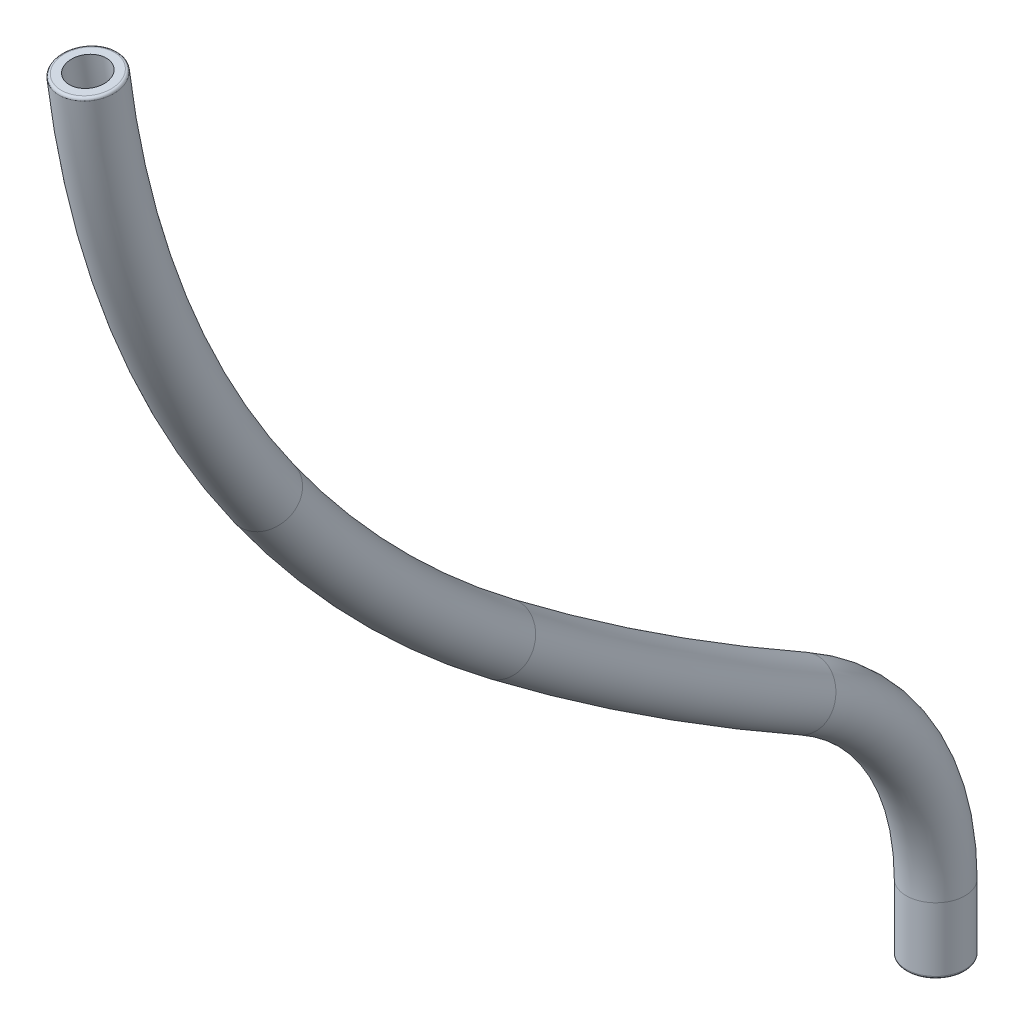
ISO-10303-21;
HEADER;
FILE_DESCRIPTION(('STEP AP214'),'2;1');
FILE_NAME('part.step','',(''),(''),'','','');
FILE_SCHEMA(('AUTOMOTIVE_DESIGN { 1 0 10303 214 1 1 1 1 }'));
ENDSEC;
DATA;
#1=APPLICATION_CONTEXT('core data for automotive mechanical design processes');
#2=APPLICATION_PROTOCOL_DEFINITION('international standard','automotive_design',2000,#1);
#3=PRODUCT_CONTEXT('',#1,'mechanical');
#4=PRODUCT('Part','Part','',(#3));
#5=PRODUCT_RELATED_PRODUCT_CATEGORY('part','',(#4));
#6=PRODUCT_DEFINITION_FORMATION('','',#4);
#7=PRODUCT_DEFINITION_CONTEXT('part definition',#1,'design');
#8=PRODUCT_DEFINITION('design','',#6,#7);
#9=PRODUCT_DEFINITION_SHAPE('','',#8);
#10=(LENGTH_UNIT() NAMED_UNIT(*) SI_UNIT(.MILLI.,.METRE.));
#11=(NAMED_UNIT(*) PLANE_ANGLE_UNIT() SI_UNIT($,.RADIAN.));
#12=(NAMED_UNIT(*) SI_UNIT($,.STERADIAN.) SOLID_ANGLE_UNIT());
#13=UNCERTAINTY_MEASURE_WITH_UNIT(LENGTH_MEASURE(1.E-05),#10,'distance_accuracy_value','');
#14=(GEOMETRIC_REPRESENTATION_CONTEXT(3) GLOBAL_UNCERTAINTY_ASSIGNED_CONTEXT((#13)) GLOBAL_UNIT_ASSIGNED_CONTEXT((#10,
#11,#12)) REPRESENTATION_CONTEXT('',''));
#15=CARTESIAN_POINT('',(0.,0.,0.));
#16=DIRECTION('',(0.,0.,1.));
#17=DIRECTION('',(1.,0.,0.));
#18=AXIS2_PLACEMENT_3D('',#15,#16,#17);
#19=CARTESIAN_POINT('',(0.,492.022492382083,-51.4306631675288));
#20=DIRECTION('',(-1.,0.,0.));
#21=DIRECTION('',(0.,0.,1.));
#22=AXIS2_PLACEMENT_3D('',#19,#20,#21);
#23=TOROIDAL_SURFACE('',#22,372.403386785215,11.);
#24=CARTESIAN_POINT('',(-10.9389506293703,445.589237813654,316.900172824865));
#25=CARTESIAN_POINT('',(-10.9386689656889,446.581433599445,317.022569606189));
#26=CARTESIAN_POINT('',(-9.9445005721548,446.568559426432,317.126958253662));
#27=CARTESIAN_POINT('',(-11.0040237684498,445.513801242333,317.510607330084));
#28=CARTESIAN_POINT('',(-11.0038954770165,446.506145093581,317.633037190342));
#29=CARTESIAN_POINT('',(-10.003657971318,446.500116921425,317.681915882388));
#30=CARTESIAN_POINT('',(-11.0170964853762,445.437690624373,318.126501851227));
#31=CARTESIAN_POINT('',(-11.0171134043711,446.430185788153,318.248943870202));
#32=CARTESIAN_POINT('',(-10.0155422594329,446.431062243931,318.241837236388));
#33=CARTESIAN_POINT('',(-10.9388699721977,445.286281841146,319.351727543584));
#34=CARTESIAN_POINT('',(-10.9391856247705,446.279070437093,319.474244096726));
#35=CARTESIAN_POINT('',(-9.9444272474525,446.293688797245,319.355712922497));
#36=CARTESIAN_POINT('',(-10.8475707366594,445.210983675921,319.961058714456));
#37=CARTESIAN_POINT('',(-10.8480243493391,446.203914734609,320.083634861014));
#38=CARTESIAN_POINT('',(-9.86142794241762,446.22537002809,319.909667254296));
#39=CARTESIAN_POINT('',(-10.5631918610782,445.063337126568,321.155860963183));
#40=CARTESIAN_POINT('',(-10.5639125423896,446.05653988466,321.278605694619));
#41=CARTESIAN_POINT('',(-9.60290169188922,446.091407723095,320.995884117802));
#42=CARTESIAN_POINT('',(-10.3701121506918,444.990988744478,321.741332024547));
#43=CARTESIAN_POINT('',(-10.3709481570911,445.984321685565,321.86417807419));
#44=CARTESIAN_POINT('',(-9.42737468244704,446.025764189103,321.528146634517));
#45=CARTESIAN_POINT('',(-9.88765317778455,444.851295379317,322.871793626736));
#46=CARTESIAN_POINT('',(-9.88869501476413,445.844872412321,322.994885344465));
#47=CARTESIAN_POINT('',(-8.98877561616776,445.899015848433,322.555869956104));
#48=CARTESIAN_POINT('',(-9.59827392840626,444.783950395564,323.416784173086));
#49=CARTESIAN_POINT('',(-9.59939576051537,445.777642775199,323.540008583219));
#50=CARTESIAN_POINT('',(-8.72570357127839,445.837911041136,323.051330765997));
#51=CARTESIAN_POINT('',(-8.9314309887007,444.656175388272,324.450813052336));
#52=CARTESIAN_POINT('',(-8.93267497135608,445.65008011365,324.574334725436));
#53=CARTESIAN_POINT('',(-8.11948271700063,445.721974849246,323.991385109837));
#54=CARTESIAN_POINT('',(-8.55396745450346,444.595745352477,324.939851484409));
#55=CARTESIAN_POINT('',(-8.55524745582463,445.589748842967,325.063523408889));
#56=CARTESIAN_POINT('',(-7.77633404954861,445.667143453534,324.435978733944));
#57=CARTESIAN_POINT('',(-7.72167048108805,444.483515207737,325.848094857624));
#58=CARTESIAN_POINT('',(-7.72297599493028,445.477696691234,325.972084491114));
#59=CARTESIAN_POINT('',(-7.01970043735279,445.565310460549,325.261679025129));
#60=CARTESIAN_POINT('',(-7.26683701175873,444.431715102151,326.267299771587));
#61=CARTESIAN_POINT('',(-7.26813085934242,445.425977712453,326.391441465585));
#62=CARTESIAN_POINT('',(-6.60621546523522,445.518308866322,325.6427856675));
#63=CARTESIAN_POINT('',(-6.29271301969407,444.33821513163,327.023974533141));
#64=CARTESIAN_POINT('',(-6.29393354665393,445.332620000304,327.148420985141));
#65=CARTESIAN_POINT('',(-5.72064819972188,445.433469885878,326.330692099418));
#66=CARTESIAN_POINT('',(-5.77342267810065,444.296515238311,327.361444610422));
#67=CARTESIAN_POINT('',(-5.774585424441,445.29098306426,327.486028956861));
#68=CARTESIAN_POINT('',(-5.24856607100059,445.395632473908,326.637492097781));
#69=CARTESIAN_POINT('',(-4.68512564281849,444.224399006572,327.945070891793));
#70=CARTESIAN_POINT('',(-4.68612490799675,445.218972840254,328.069914996016));
#71=CARTESIAN_POINT('',(-4.259205129835,445.330195837122,327.168077013965));
#72=CARTESIAN_POINT('',(-4.11611900253577,444.193982656029,328.191227193973));
#73=CARTESIAN_POINT('',(-4.11702099463693,445.188601097223,328.316180536576));
#74=CARTESIAN_POINT('',(-3.74192636594161,445.302596601309,327.39186202096));
#75=CARTESIAN_POINT('',(-2.94454353238739,444.145296752098,328.585237862403));
#76=CARTESIAN_POINT('',(-2.94521037518814,445.13998494026,328.710378662189));
#77=CARTESIAN_POINT('',(-2.67685775671581,445.258419820499,327.750064011381));
#78=CARTESIAN_POINT('',(-2.34197482499202,444.127027154388,328.733092587337));
#79=CARTESIAN_POINT('',(-2.34251581659257,445.121741605657,328.858302495641));
#80=CARTESIAN_POINT('',(-2.12906802272002,445.241842235287,327.884481320893));
#81=CARTESIAN_POINT('',(-1.12037738498151,444.103153040165,328.926304438881));
#82=CARTESIAN_POINT('',(-1.12063780228041,445.09790115951,329.051609819212));
#83=CARTESIAN_POINT('',(-1.01852489543774,445.220179174446,328.060133583683));
#84=CARTESIAN_POINT('',(-0.501348622937057,444.097548546299,328.971661382221));
#85=CARTESIAN_POINT('',(-0.501468613220143,445.092304642712,329.096988486919));
#86=CARTESIAN_POINT('',(-0.455771475397328,445.215093719365,328.101368370345));
#87=CARTESIAN_POINT('',(0.735592897777408,444.099163752542,328.958589593615));
#88=CARTESIAN_POINT('',(0.735767772413724,445.09391758219,329.083910165657));
#89=CARTESIAN_POINT('',(0.668720816161282,445.216559338292,328.089484579651));
#90=CARTESIAN_POINT('',(1.35350566086319,444.106383401798,328.900161273229));
#91=CARTESIAN_POINT('',(1.3538199642516,445.101126948542,329.025453905844));
#92=CARTESIAN_POINT('',(1.23045969169381,445.223110366155,328.036366376451));
#93=CARTESIAN_POINT('',(2.5706781842207,444.133441947045,328.6811780801));
#94=CARTESIAN_POINT('',(2.57126897380866,445.128147281524,328.806362861213));
#95=CARTESIAN_POINT('',(2.33698016747338,445.247662929697,327.837284936618));
#96=CARTESIAN_POINT('',(3.16993790704457,444.153280868368,328.520623002339));
#97=CARTESIAN_POINT('',(3.17065166215386,445.147957627123,328.645733111952));
#98=CARTESIAN_POINT('',(2.8817617336769,445.265664488363,327.691321513602));
#99=CARTESIAN_POINT('',(4.3328026568719,444.205015396129,328.101940388645));
#100=CARTESIAN_POINT('',(4.33374382676597,445.199617838465,328.226852646029));
#101=CARTESIAN_POINT('',(3.93891150624718,445.312607507265,327.310689822045));
#102=CARTESIAN_POINT('',(4.89640701998706,444.236911226984,327.843811036542));
#103=CARTESIAN_POINT('',(4.89744100132872,445.231466742371,327.968609728309));
#104=CARTESIAN_POINT('',(4.45127910907913,445.341549171131,327.076019902392));
#105=CARTESIAN_POINT('',(5.97192827651459,444.31185302708,327.237318466332));
#106=CARTESIAN_POINT('',(5.97311518984241,445.306297950957,327.361850082859));
#107=CARTESIAN_POINT('',(5.42902570592233,445.409549595263,326.524646832035));
#108=CARTESIAN_POINT('',(6.48384719794336,444.354898558597,326.888958790568));
#109=CARTESIAN_POINT('',(6.48508633557585,445.349278217684,327.013349879622));
#110=CARTESIAN_POINT('',(5.89440654358486,445.448607958358,326.207946901737));
#111=CARTESIAN_POINT('',(7.44144174495586,444.450913091835,326.111935270094));
#112=CARTESIAN_POINT('',(7.44274198482708,445.445145950932,326.236018162883));
#113=CARTESIAN_POINT('',(6.76494704086896,445.53572845977,325.501541037832));
#114=CARTESIAN_POINT('',(7.88712416099397,444.503881075064,325.683279667385));
#115=CARTESIAN_POINT('',(7.88843002634539,445.498030554811,325.807209860761));
#116=CARTESIAN_POINT('',(7.17011287363088,445.583789673986,325.11184259718));
#117=CARTESIAN_POINT('',(8.69976386631999,444.618257397537,324.757669453443));
#118=CARTESIAN_POINT('',(8.7010316760564,445.612224453905,324.881282683639));
#119=CARTESIAN_POINT('',(7.90887624210908,445.687569854029,324.270353779382));
#120=CARTESIAN_POINT('',(9.06670155973732,444.679667831489,324.26069789193));
#121=CARTESIAN_POINT('',(9.06792748812077,445.673533947064,324.384162203626));
#122=CARTESIAN_POINT('',(8.24245596339756,445.743290720336,323.818547992412));
#123=CARTESIAN_POINT('',(9.71143942147574,444.809197053038,323.212474852978));
#124=CARTESIAN_POINT('',(9.71253163721777,445.802846563803,323.335646765119));
#125=CARTESIAN_POINT('',(8.82858129225068,445.860818376799,322.865589453944));
#126=CARTESIAN_POINT('',(9.98919664946346,444.87731905168,322.66119739373));
#127=CARTESIAN_POINT('',(9.99020377840603,445.870851159727,322.78423986829));
#128=CARTESIAN_POINT('',(9.08108786314861,445.922628080063,322.364413081861));
#129=CARTESIAN_POINT('',(10.4471934945817,445.018262713186,321.520620194565));
#130=CARTESIAN_POINT('',(10.4479856509893,446.011546962636,321.643425265637));
#131=CARTESIAN_POINT('',(9.49744863143789,446.050510594394,321.327493452719));
#132=CARTESIAN_POINT('',(10.6275500149925,445.09107862419,320.931366989839));
#133=CARTESIAN_POINT('',(10.6282232688502,446.084231031901,321.054075435118));
#134=CARTESIAN_POINT('',(9.66140910453863,446.116578187876,320.791792501817));
#135=CARTESIAN_POINT('',(10.8375480379322,445.211485619777,319.956997894717));
#136=CARTESIAN_POINT('',(10.8380055480718,446.204418254375,320.07955213296));
#137=CARTESIAN_POINT('',(9.85231639812018,446.225825332714,319.905975472783));
#138=CARTESIAN_POINT('',(10.8983465389391,445.258293414613,319.578217404241));
#139=CARTESIAN_POINT('',(10.8987165307857,446.251137875116,319.700731837894));
#140=CARTESIAN_POINT('',(9.90758776267188,446.268294547715,319.561619069578));
#141=CARTESIAN_POINT('',(10.9795553687277,445.352433564906,318.816415833447));
#142=CARTESIAN_POINT('',(10.9797420700025,446.345097906917,318.938868483562));
#143=CARTESIAN_POINT('',(9.98141397157074,446.353708443977,318.869051003497));
#144=CARTESIAN_POINT('',(10.9999656974342,445.399765920364,318.43339475312));
#145=CARTESIAN_POINT('',(11.0000603279156,446.392338196757,318.555826407191));
#146=CARTESIAN_POINT('',(9.99996881584956,446.39665312524,318.520839340614));
#147=CARTESIAN_POINT('',(11.0000546401598,445.522899508129,317.43698353165));
#148=CARTESIAN_POINT('',(10.999904147137,446.515225104725,317.559413037445));
#149=CARTESIAN_POINT('',(10.0000496728729,446.508371691931,317.614983091645));
#150=CARTESIAN_POINT('',(10.9479298129737,445.598735165034,316.823318241271));
#151=CARTESIAN_POINT('',(10.9476356297607,446.590907228199,316.945753853345));
#152=CARTESIAN_POINT('',(9.9526634663398,446.577176433292,317.057088314017));
#153=CARTESIAN_POINT('',(10.7405522120217,445.74832096413,315.612874669198));
#154=CARTESIAN_POINT('',(10.7399705522066,446.740182528293,315.735373453623));
#155=CARTESIAN_POINT('',(9.76413837456506,446.712892547405,315.956650905118));
#156=CARTESIAN_POINT('',(10.5851753076317,445.822068484544,315.016117616199));
#157=CARTESIAN_POINT('',(10.5844650264162,446.81377364838,315.138668913155));
#158=CARTESIAN_POINT('',(9.62288664330149,446.779801539998,315.414127573071));
#159=CARTESIAN_POINT('',(10.1757165750825,445.9652890508,313.857202104193));
#160=CARTESIAN_POINT('',(10.1747661830847,446.95668283884,313.979907329939));
#161=CARTESIAN_POINT('',(9.25065143189322,446.909740313905,314.360535016226));
#162=CARTESIAN_POINT('',(9.92168188557633,446.034764119683,313.29502727019));
#163=CARTESIAN_POINT('',(9.92063280997782,447.026004065549,313.417824694428));
#164=CARTESIAN_POINT('',(9.0197108050694,446.972771931191,313.84945090467));
#165=CARTESIAN_POINT('',(9.32218334240934,446.167478831985,312.221141648017));
#166=CARTESIAN_POINT('',(9.32096940073938,447.15841775533,312.3441645868));
#167=CARTESIAN_POINT('',(8.47471212946301,447.093177100201,312.873160409843));
#168=CARTESIAN_POINT('',(8.97674222410902,446.230720020586,311.709418354506));
#169=CARTESIAN_POINT('',(8.97547099652998,447.221513369389,311.832561565294));
#170=CARTESIAN_POINT('',(8.16067474919,447.150552054033,312.407942657753));
#171=CARTESIAN_POINT('',(8.20416738782396,446.349200240138,310.750728877647));
#172=CARTESIAN_POINT('',(8.20282589125202,447.339714600515,310.874141429561));
#173=CARTESIAN_POINT('',(7.45833398893087,447.25804133812,311.536379026276));
#174=CARTESIAN_POINT('',(7.77702525027432,446.404438445323,310.303769376776));
#175=CARTESIAN_POINT('',(7.77567467921893,447.394821289644,310.42731562266));
#176=CARTESIAN_POINT('',(7.07002295479485,447.308154919132,311.130039222052));
#177=CARTESIAN_POINT('',(6.85317744828255,446.505337802373,309.487347818961));
#178=CARTESIAN_POINT('',(6.85185990968617,447.495475355006,309.611174521022));
#179=CARTESIAN_POINT('',(6.23016131662051,447.399692992544,310.387814019248));
#180=CARTESIAN_POINT('',(6.35646905440355,446.55099857829,309.117888804174));
#181=CARTESIAN_POINT('',(6.35519201131849,447.5410243195,309.241846348065));
#182=CARTESIAN_POINT('',(5.77860823127596,447.441117143855,310.051931386354));
#183=CARTESIAN_POINT('',(5.30761391436356,446.631443036986,308.466984481554));
#184=CARTESIAN_POINT('',(5.30647006996695,447.621268095852,308.591199562998));
#185=CARTESIAN_POINT('',(4.82510355851232,447.514097257905,309.460181113138));
#186=CARTESIAN_POINT('',(4.7554683941593,446.666226960229,308.185537227962));
#187=CARTESIAN_POINT('',(4.75441023664218,447.655964946439,308.309864420111));
#188=CARTESIAN_POINT('',(4.32315308559937,447.545653438804,309.20431170389));
#189=CARTESIAN_POINT('',(3.61140475555698,446.723931242014,307.718635810842));
#190=CARTESIAN_POINT('',(3.61056517319965,447.713522459472,307.843166409201));
#191=CARTESIAN_POINT('',(3.28309523232453,447.598002950396,308.779842131723));
#192=CARTESIAN_POINT('',(3.01948671794928,446.746851624653,307.533181452329));
#193=CARTESIAN_POINT('',(3.01876836771827,447.736384565736,307.657791834165));
#194=CARTESIAN_POINT('',(2.74498792540844,447.618796302951,308.61124179154));
#195=CARTESIAN_POINT('',(1.81268084736495,446.780178046238,307.263529684042));
#196=CARTESIAN_POINT('',(1.81224165357646,447.769625146135,307.388264678873));
#197=CARTESIAN_POINT('',(1.64789167942268,447.649029965015,308.366095863503));
#198=CARTESIAN_POINT('',(1.19779304835719,446.790584103689,307.179332124531));
#199=CARTESIAN_POINT('',(1.19749681386625,447.780004508445,307.304104896949));
#200=CARTESIAN_POINT('',(1.08890277123381,447.658470291314,308.28955013952));
#201=CARTESIAN_POINT('',(-0.0374971143950822,446.798586419396,307.114583715367));
#202=CARTESIAN_POINT('',(-0.0374855483127154,447.787986094329,307.239387190097));
#203=CARTESIAN_POINT('',(-0.0340882858137124,447.665729956681,308.230686036324));
#204=CARTESIAN_POINT('',(-0.657899468130439,446.796182700898,307.13403267763));
#205=CARTESIAN_POINT('',(-0.657739594678398,447.785588555376,307.258827339633));
#206=CARTESIAN_POINT('',(-0.598090425573131,447.663549316839,308.248367486119));
#207=CARTESIAN_POINT('',(-1.88660758561607,446.778633791214,307.27602466247));
#208=CARTESIAN_POINT('',(-1.88614659210944,447.768085046096,307.400752390498));
#209=CARTESIAN_POINT('',(-1.71509780510552,447.647629013959,308.377455302731));
#210=CARTESIAN_POINT('',(-2.49491336551266,446.763488617037,307.39856754743));
#211=CARTESIAN_POINT('',(-2.49431572701384,447.75297862557,307.523240942209));
#212=CARTESIAN_POINT('',(-2.26810305955696,447.633889366352,308.488861544437));
#213=CARTESIAN_POINT('',(-3.68216185183013,446.720886876781,307.743268694662));
#214=CARTESIAN_POINT('',(-3.68130430715974,447.710486188118,307.867785641799));
#215=CARTESIAN_POINT('',(-3.34741986530013,447.595241083913,308.802236386201));
#216=CARTESIAN_POINT('',(-4.26110452723655,446.6934302977,307.96542706215));
#217=CARTESIAN_POINT('',(-4.26013763347507,447.683099066325,308.089850748369));
#218=CARTESIAN_POINT('',(-3.87373138839689,447.570332437285,309.004205081913));
#219=CARTESIAN_POINT('',(-5.37319196348446,446.62698540408,308.503052816152));
#220=CARTESIAN_POINT('',(-5.37203604117787,447.616822082239,308.627249517221));
#221=CARTESIAN_POINT('',(-4.88471996680407,447.510053236366,309.492971564093));
#222=CARTESIAN_POINT('',(-5.90633670341841,446.587997084277,308.818520245263));
#223=CARTESIAN_POINT('',(-5.90511114871161,447.57793063011,308.94259607049));
#224=CARTESIAN_POINT('',(-5.36939700310764,447.474682677298,309.779769389288));
#225=CARTESIAN_POINT('',(-6.91169351242512,446.499595832253,309.533808669786));
#226=CARTESIAN_POINT('',(-6.91037113092682,447.48974794885,309.657614488972));
#227=CARTESIAN_POINT('',(-6.28335773856827,447.394483751426,310.430052509759));
#228=CARTESIAN_POINT('',(-7.38390560533611,446.450182904109,309.933629632196));
#229=CARTESIAN_POINT('',(-7.38256107773461,447.440454836801,310.057301621591));
#230=CARTESIAN_POINT('',(-6.71264145939644,447.349655388321,310.793537775034));
#231=CARTESIAN_POINT('',(-8.25399421991925,446.342335312352,310.806276777909));
#232=CARTESIAN_POINT('',(-8.25265561482159,447.332866493142,310.929668465408));
#233=CARTESIAN_POINT('',(-7.5036311090175,447.251813248349,311.586878725706));
#234=CARTESIAN_POINT('',(-8.65187051593982,446.283900621353,311.279103182818));
#235=CARTESIAN_POINT('',(-8.65055950219957,447.274569269068,311.402364332261));
#236=CARTESIAN_POINT('',(-7.86533683267257,447.198799446635,312.016734612569));
#237=CARTESIAN_POINT('',(-9.36199148916755,446.159668746712,312.284338249174));
#238=CARTESIAN_POINT('',(-9.36078779858473,447.150626032324,312.407342813883));
#239=CARTESIAN_POINT('',(-8.5109013537887,447.086091431522,312.930613682307));
#240=CARTESIAN_POINT('',(-9.67423615346964,446.093871561961,312.816746919602));
#241=CARTESIAN_POINT('',(-9.67310632294519,447.08497820549,312.939640138579));
#242=CARTESIAN_POINT('',(-8.79476013951786,447.026397217115,313.414636873344));
#243=CARTESIAN_POINT('',(-10.2042312637069,445.95678253889,313.926035050128));
#244=CARTESIAN_POINT('',(-10.2032972166768,446.948195399763,314.048726685156));
#245=CARTESIAN_POINT('',(-9.27657387609722,446.902022694285,314.423112385119));
#246=CARTESIAN_POINT('',(-10.4219813687906,445.885490680752,314.502914670629));
#247=CARTESIAN_POINT('',(-10.4211587354075,446.877058948645,314.625527844389));
#248=CARTESIAN_POINT('',(-9.47452851708231,446.837342367877,314.94756485168));
#249=CARTESIAN_POINT('',(-10.7568045697059,445.739436500546,315.684767140881));
#250=CARTESIAN_POINT('',(-10.7562433017135,446.73131698069,315.807258655299));
#251=CARTESIAN_POINT('',(-9.77891324518716,446.704831892778,316.022009731151));
#252=CARTESIAN_POINT('',(-10.8738776683369,445.664674178575,316.28973998985));
#253=CARTESIAN_POINT('',(-10.8734524785236,446.656710534796,316.412195840117));
#254=CARTESIAN_POINT('',(-9.88534333485171,446.637001744174,316.572002143351));
#255=CARTESIAN_POINT('',(-10.9389506293703,445.589237813654,316.900172824865));
#256=CARTESIAN_POINT('',(-10.9386689656889,446.581433599445,317.022569606189));
#257=CARTESIAN_POINT('',(-9.9445005721548,446.568559426432,317.126958253662));
#258=(BOUNDED_SURFACE() B_SPLINE_SURFACE(3,2,((#24,#25,#26),(#27,#28,#29),(#30,#31,#32),(#33,
#34,#35),(#36,#37,#38),(#39,#40,#41),(#42,#43,#44),(#45,#46,#47),(#48,#49,#50),(#51,#52,#53),
(#54,#55,#56),(#57,#58,#59),(#60,#61,#62),(#63,#64,#65),(#66,#67,#68),(#69,#70,#71),(#72,#73,
#74),(#75,#76,#77),(#78,#79,#80),(#81,#82,#83),(#84,#85,#86),(#87,#88,#89),(#90,#91,#92),(#93,
#94,#95),(#96,#97,#98),(#99,#100,#101),(#102,#103,#104),(#105,#106,#107),(#108,#109,#110),(#111,
#112,#113),(#114,#115,#116),(#117,#118,#119),(#120,#121,#122),(#123,#124,#125),(#126,#127,#128),
(#129,#130,#131),(#132,#133,#134),(#135,#136,#137),(#138,#139,#140),(#141,#142,#143),(#144,#145,
#146),(#147,#148,#149),(#150,#151,#152),(#153,#154,#155),(#156,#157,#158),(#159,#160,#161),
(#162,#163,#164),(#165,#166,#167),(#168,#169,#170),(#171,#172,#173),(#174,#175,#176),(#177,#178,
#179),(#180,#181,#182),(#183,#184,#185),(#186,#187,#188),(#189,#190,#191),(#192,#193,#194),
(#195,#196,#197),(#198,#199,#200),(#201,#202,#203),(#204,#205,#206),(#207,#208,#209),(#210,#211,
#212),(#213,#214,#215),(#216,#217,#218),(#219,#220,#221),(#222,#223,#224),(#225,#226,#227),
(#228,#229,#230),(#231,#232,#233),(#234,#235,#236),(#237,#238,#239),(#240,#241,#242),(#243,#244,
#245),(#246,#247,#248),(#249,#250,#251),(#252,#253,#254),(#255,#256,#257)),.UNSPECIFIED.,.T.,
.F.,.F.) B_SPLINE_SURFACE_WITH_KNOTS((4,2,2,2,2,2,2,2,2,2,2,2,2,2,2,2,2,2,2,2,2,2,2,2,2,2,2,2,2,
2,2,2,2,2,2,2,2,2,4),(3,3),(0.,1.68485678322189,3.36971365415543,5.05457168954533,
6.73942949499384,8.42428431404281,10.1091397888121,11.7939905287712,13.4788394588599,
15.1636822412214,16.8485280361554,18.5333671498463,20.2182096458043,21.9030835036171,
23.5878912251888,25.2725261038021,26.957579724178,28.6434434841935,30.3272792968954,
31.3795127215206,32.4317461481046,34.1155889273731,35.8014597094992,37.4865259722428,
39.1711735047442,40.8559947394683,42.540882096798,44.2257322021205,45.9105788850915,
47.5954230765221,49.2802642105112,50.9651030954488,52.6499437599422,54.3347851935903,
56.0196259680883,57.7044718569569,59.3893179997393,61.0741702198849,62.7590223931838),(0.,1.),
.UNSPECIFIED.) GEOMETRIC_REPRESENTATION_ITEM() RATIONAL_B_SPLINE_SURFACE(((1.,0.707206941378569,
1.),(1.,0.707153562016762,1.),(1.,0.707099942539601,1.),(1.,0.706993744181179,1.),(1.,
0.706941165299973,1.),(1.,0.70683850026026,1.),(1.,0.706788414103474,1.),(1.,0.706692082133106,
1.),(1.,0.706645836318999,1.),(1.,0.706558398649526,1.),(1.,0.706517206785202,1.),(1.,
0.706440933195329,1.),(1.,0.706405851472159,1.),(1.,0.706342679712797,1.),(1.,0.706314589656957,
1.),(1.,0.706266094921054,1.),(1.,0.706245690232736,1.),(1.,0.706213063573711,1.),(1.,
0.706200841573149,1.),(1.,0.706184875373194,1.),(1.,0.706181131188959,1.),(1.,0.706182210701924,
1.),(1.,0.706187034365148,1.),(1.,0.706205133500991,1.),(1.,0.706218408990579,1.),(1.,
0.706253091135893,1.),(1.,0.706274497942969,1.),(1.,0.706324919326297,1.),(1.,0.706353933603889,
1.),(1.,0.706418848479126,1.),(1.,0.706454748370004,1.),(1.,0.706532544025892,1.),(1.,
0.70657444127905,1.),(1.,0.706663161792279,1.),(1.,0.70670998741099,1.),(1.,0.706807281392992,
1.),(1.,0.706857745306622,1.),(1.,0.706941559385934,1.),(1.,0.706974228699837,1.),(1.,
0.707040114359543,1.),(1.,0.707073330705346,1.),(1.,0.70715998235395,1.),(1.,0.707213586117675,
1.),(1.,0.707319780806307,1.),(1.,0.707372370433606,1.),(1.,0.707474923290487,1.),(1.,
0.707524887761443,1.),(1.,0.707620692612816,1.),(1.,0.707666534014961,1.),(1.,0.707752700273165,
1.),(1.,0.70779302455993,1.),(1.,0.707866883717789,1.),(1.,0.707900418322363,1.),(1.,
0.707959622715602,1.),(1.,0.707985292678139,1.),(1.,0.708027936294584,1.),(1.,0.708044909966157,
1.),(1.,0.70806960530502,1.),(1.,0.708077326985993,1.),(1.,0.708083264140947,1.),(1.,
0.708081479632178,1.),(1.,0.708068463291428,1.),(1.,0.708057231472058,1.),(1.,0.708025689732279,
1.),(1.,0.708005379802281,1.),(1.,0.707956344733493,1.),(1.,0.70792761959086,1.),(1.,
0.707862681296441,1.),(1.,0.707826468147583,1.),(1.,0.707747705320477,1.),(1.,0.707705155622995,
1.),(1.,0.70761504842455,1.),(1.,0.707567490922831,1.),(1.,0.707468821888558,1.),(1.,
0.707417710343185,1.),(1.,0.707313459696041,1.),(1.,0.707260320594325,1.),(1.,0.707206941378569,1.))) REPRESENTATION_ITEM('') SURFACE());
#259=CARTESIAN_POINT('',(-10.9389506293703,445.589237813654,316.900172824865));
#260=CARTESIAN_POINT('',(-10.8738776683369,445.664674178575,316.28973998985));
#261=CARTESIAN_POINT('',(-10.7568045697059,445.739436500546,315.684767140881));
#262=CARTESIAN_POINT('',(-10.4219813687906,445.885490680752,314.502914670629));
#263=CARTESIAN_POINT('',(-10.2042312637069,445.95678253889,313.926035050128));
#264=CARTESIAN_POINT('',(-9.67423615346964,446.093871561961,312.816746919602));
#265=CARTESIAN_POINT('',(-9.36199148916755,446.159668746712,312.284338249174));
#266=CARTESIAN_POINT('',(-8.65187051593982,446.283900621353,311.279103182818));
#267=CARTESIAN_POINT('',(-8.25399421991925,446.342335312352,310.806276777909));
#268=CARTESIAN_POINT('',(-7.38390560533611,446.450182904109,309.933629632196));
#269=CARTESIAN_POINT('',(-6.91169351242512,446.499595832253,309.533808669786));
#270=CARTESIAN_POINT('',(-5.90633670341841,446.587997084277,308.818520245263));
#271=CARTESIAN_POINT('',(-5.37319196348446,446.62698540408,308.503052816152));
#272=CARTESIAN_POINT('',(-4.26110452723655,446.6934302977,307.96542706215));
#273=CARTESIAN_POINT('',(-3.68216185183013,446.720886876781,307.743268694662));
#274=CARTESIAN_POINT('',(-2.49491336551266,446.763488617037,307.39856754743));
#275=CARTESIAN_POINT('',(-1.88660758561606,446.778633791214,307.27602466247));
#276=CARTESIAN_POINT('',(-0.657899468130438,446.796182700898,307.13403267763));
#277=CARTESIAN_POINT('',(-0.037497114395081,446.798586419396,307.114583715367));
#278=CARTESIAN_POINT('',(1.19779304835719,446.790584103689,307.179332124531));
#279=CARTESIAN_POINT('',(1.81268084736495,446.780178046238,307.263529684042));
#280=CARTESIAN_POINT('',(3.01948671794928,446.746851624653,307.533181452329));
#281=CARTESIAN_POINT('',(3.61140475555698,446.723931242014,307.718635810842));
#282=CARTESIAN_POINT('',(4.7554683941593,446.666226960229,308.185537227962));
#283=CARTESIAN_POINT('',(5.30761391436356,446.631443036986,308.466984481554));
#284=CARTESIAN_POINT('',(6.35646905440355,446.55099857829,309.117888804174));
#285=CARTESIAN_POINT('',(6.85317744828255,446.505337802373,309.487347818961));
#286=CARTESIAN_POINT('',(7.77702525027432,446.404438445323,310.303769376776));
#287=CARTESIAN_POINT('',(8.20416738782396,446.349200240138,310.750728877647));
#288=CARTESIAN_POINT('',(8.97674222410902,446.230720020586,311.709418354506));
#289=CARTESIAN_POINT('',(9.32218334240934,446.167478831985,312.221141648017));
#290=CARTESIAN_POINT('',(9.92168188557633,446.034764119683,313.29502727019));
#291=CARTESIAN_POINT('',(10.1757165750825,445.9652890508,313.857202104193));
#292=CARTESIAN_POINT('',(10.5851753076317,445.822068484544,315.016117616199));
#293=CARTESIAN_POINT('',(10.7405522120217,445.74832096413,315.612874669198));
#294=CARTESIAN_POINT('',(10.9479298129737,445.598735165034,316.823318241271));
#295=CARTESIAN_POINT('',(11.0000546401598,445.522899508129,317.43698353165));
#296=CARTESIAN_POINT('',(10.9999656974342,445.399765920364,318.43339475312));
#297=CARTESIAN_POINT('',(10.9795553687277,445.352433564906,318.816415833447));
#298=CARTESIAN_POINT('',(10.8983465389391,445.258293414613,319.578217404241));
#299=CARTESIAN_POINT('',(10.8375480379322,445.211485619777,319.956997894717));
#300=CARTESIAN_POINT('',(10.6275500149925,445.09107862419,320.931366989839));
#301=CARTESIAN_POINT('',(10.4471934945817,445.018262713186,321.520620194565));
#302=CARTESIAN_POINT('',(9.98919664946346,444.87731905168,322.66119739373));
#303=CARTESIAN_POINT('',(9.71143942147574,444.809197053038,323.212474852979));
#304=CARTESIAN_POINT('',(9.06670155973732,444.679667831489,324.26069789193));
#305=CARTESIAN_POINT('',(8.69976386631999,444.618257397538,324.757669453443));
#306=CARTESIAN_POINT('',(7.88712416099397,444.503881075064,325.683279667385));
#307=CARTESIAN_POINT('',(7.44144174495586,444.450913091835,326.111935270094));
#308=CARTESIAN_POINT('',(6.48384719794336,444.354898558597,326.888958790568));
#309=CARTESIAN_POINT('',(5.97192827651459,444.31185302708,327.237318466332));
#310=CARTESIAN_POINT('',(4.89640701998706,444.236911226984,327.843811036542));
#311=CARTESIAN_POINT('',(4.3328026568719,444.205015396129,328.101940388645));
#312=CARTESIAN_POINT('',(3.16993790704457,444.153280868368,328.520623002339));
#313=CARTESIAN_POINT('',(2.5706781842207,444.133441947045,328.6811780801));
#314=CARTESIAN_POINT('',(1.35350566086319,444.106383401798,328.900161273229));
#315=CARTESIAN_POINT('',(0.73559289777741,444.099163752542,328.958589593615));
#316=CARTESIAN_POINT('',(-0.501348622937056,444.097548546299,328.971661382221));
#317=CARTESIAN_POINT('',(-1.12037738498152,444.103153040165,328.926304438881));
#318=CARTESIAN_POINT('',(-2.34197482499202,444.127027154388,328.733092587337));
#319=CARTESIAN_POINT('',(-2.94454353238739,444.145296752098,328.585237862403));
#320=CARTESIAN_POINT('',(-4.11611900253577,444.193982656029,328.191227193973));
#321=CARTESIAN_POINT('',(-4.68512564281849,444.224399006572,327.945070891793));
#322=CARTESIAN_POINT('',(-5.77342267810065,444.296515238311,327.361444610422));
#323=CARTESIAN_POINT('',(-6.29271301969407,444.33821513163,327.023974533141));
#324=CARTESIAN_POINT('',(-7.26683701175873,444.431715102151,326.267299771587));
#325=CARTESIAN_POINT('',(-7.72167048108805,444.483515207737,325.848094857624));
#326=CARTESIAN_POINT('',(-8.55396745450346,444.595745352477,324.939851484409));
#327=CARTESIAN_POINT('',(-8.93143098870071,444.656175388272,324.450813052336));
#328=CARTESIAN_POINT('',(-9.59827392840626,444.783950395564,323.416784173086));
#329=CARTESIAN_POINT('',(-9.88765317778455,444.851295379317,322.871793626736));
#330=CARTESIAN_POINT('',(-10.3701121506918,444.990988744478,321.741332024547));
#331=CARTESIAN_POINT('',(-10.5631918610782,445.063337126568,321.155860963183));
#332=CARTESIAN_POINT('',(-10.8475707366594,445.210983675921,319.961058714456));
#333=CARTESIAN_POINT('',(-10.9388699721977,445.286281841146,319.351727543584));
#334=CARTESIAN_POINT('',(-11.0170964853762,445.437690624373,318.126501851227));
#335=CARTESIAN_POINT('',(-11.0040237684498,445.513801242333,317.510607330084));
#336=CARTESIAN_POINT('',(-10.9389506293703,445.589237813654,316.900172824865));
#337=B_SPLINE_CURVE_WITH_KNOTS('',3,(#259,#260,#261,#262,#263,#264,#265,#266,#267,#268,#269,
#270,#271,#272,#273,#274,#275,#276,#277,#278,#279,#280,#281,#282,#283,#284,#285,#286,#287,#288,
#289,#290,#291,#292,#293,#294,#295,#296,#297,#298,#299,#300,#301,#302,#303,#304,#305,#306,#307,
#308,#309,#310,#311,#312,#313,#314,#315,#316,#317,#318,#319,#320,#321,#322,#323,#324,#325,#326,
#327,#328,#329,#330,#331,#332,#333,#334,#335,#336),.UNSPECIFIED.,.T.,.F.,(4,2,2,2,2,2,2,2,2,2,2,
2,2,2,2,2,2,2,2,2,2,2,2,2,2,2,2,2,2,2,2,2,2,2,2,2,2,2,4),(0.,1.68485217329892,3.36970439344445,
5.05455053622693,6.73939642509551,8.42423719959353,10.1090786332416,11.793919297735,
13.4787581826725,15.1635993166617,16.8484435080923,18.5332901910632,20.2181402963858,
21.9030276537155,23.5878488884396,25.2724964209409,26.9575626836846,28.6434334658107,
30.3272762450792,31.3795096716631,32.4317430962884,34.1155789089903,35.8014426690058,
37.4864962893817,39.171131167995,40.8559388895667,42.5408127473795,44.2256552433375,
45.9104943570284,47.5953401519624,49.2801829343239,50.9650318644126,52.6498826043717,
54.334738079141,56.0195928981899,57.7044507036385,59.3893087390284,61.0741656099619,
62.7590223931838),.UNSPECIFIED.);
#338=CARTESIAN_POINT('',(-10.9389506293703,445.589237813654,316.900172824865));
#339=VERTEX_POINT('',#338);
#340=EDGE_CURVE('E48',#339,#339,#337,.T.);
#341=ORIENTED_EDGE('',*,*,#340,.T.);
#342=EDGE_LOOP('',(#341));
#343=FACE_BOUND('',#342,.T.);
#344=CARTESIAN_POINT('',(0.,275.780055692323,251.758207115623));
#345=DIRECTION('',(0.,0.814141012251358,0.580667212928656));
#346=DIRECTION('',(-1.,0.,0.));
#347=AXIS2_PLACEMENT_3D('',#344,#345,#346);
#348=CIRCLE('',#347,11.);
#349=CARTESIAN_POINT('',(0.,269.392716350108,260.713758250388));
#350=VERTEX_POINT('',#349);
#351=EDGE_CURVE('E111',#350,#350,#348,.T.);
#352=ORIENTED_EDGE('',*,*,#351,.T.);
#353=EDGE_LOOP('',(#352));
#354=FACE_BOUND('',#353,.T.);
#355=ADVANCED_FACE('F33',(#343,#354),#23,.T.);
#356=CARTESIAN_POINT('',(0.,521.255043149591,-92.4169939653596));
#357=DIRECTION('',(-1.,0.,0.));
#358=DIRECTION('',(0.,0.,1.));
#359=AXIS2_PLACEMENT_3D('',#356,#357,#358);
#360=TOROIDAL_SURFACE('',#359,422.746423410395,11.);
#361=CARTESIAN_POINT('',(0.,184.369526620966,162.970333949559));
#362=DIRECTION('',(0.,0.604114698013636,0.796897378364299));
#363=DIRECTION('',(-1.,0.,0.));
#364=AXIS2_PLACEMENT_3D('',#361,#362,#363);
#365=CIRCLE('',#364,11.);
#366=CARTESIAN_POINT('',(0.,175.603655458959,169.615595627709));
#367=VERTEX_POINT('',#366);
#368=EDGE_CURVE('E108',#367,#367,#365,.T.);
#369=CARTESIAN_POINT('',(0.,521.255043149591,-92.4169939653596));
#370=DIRECTION('',(-1.,0.,0.));
#371=DIRECTION('',(0.,0.,1.));
#372=AXIS2_PLACEMENT_3D('',#369,#370,#371);
#373=CIRCLE('',#372,433.746423410395);
#374=EDGE_CURVE('',#367,#350,#373,.T.);
#375=ORIENTED_EDGE('',*,*,#368,.T.);
#376=ORIENTED_EDGE('',*,*,#351,.F.);
#377=ORIENTED_EDGE('',*,*,#374,.T.);
#378=ORIENTED_EDGE('',*,*,#374,.F.);
#379=EDGE_LOOP('',(#375,#377,#376,#378));
#380=FACE_BOUND('',#379,.T.);
#381=ADVANCED_FACE('F97',(#380),#360,.T.);
#382=CARTESIAN_POINT('',(0.,983.876536867535,-443.122682752639));
#383=DIRECTION('',(-1.,0.,0.));
#384=DIRECTION('',(0.,0.,1.));
#385=AXIS2_PLACEMENT_3D('',#382,#383,#384);
#386=TOROIDAL_SURFACE('',#385,1003.27474020259,11.);
#387=CARTESIAN_POINT('',(0.,109.979967075604,49.6906588225208));
#388=DIRECTION('',(0.,0.491204773555492,0.871044126572413));
#389=DIRECTION('',(-1.,0.,0.));
#390=AXIS2_PLACEMENT_3D('',#387,#388,#389);
#391=CIRCLE('',#390,11.);
#392=CARTESIAN_POINT('',(0.,100.398481683307,55.0939113316312));
#393=VERTEX_POINT('',#392);
#394=EDGE_CURVE('E114',#393,#393,#391,.T.);
#395=CARTESIAN_POINT('',(0.,983.876536867535,-443.122682752639));
#396=DIRECTION('',(-1.,0.,0.));
#397=DIRECTION('',(0.,0.,1.));
#398=AXIS2_PLACEMENT_3D('',#395,#396,#397);
#399=CIRCLE('',#398,1014.27474020259);
#400=EDGE_CURVE('',#393,#367,#399,.T.);
#401=ORIENTED_EDGE('',*,*,#394,.T.);
#402=ORIENTED_EDGE('',*,*,#368,.F.);
#403=ORIENTED_EDGE('',*,*,#400,.T.);
#404=ORIENTED_EDGE('',*,*,#400,.F.);
#405=EDGE_LOOP('',(#401,#403,#402,#404));
#406=FACE_BOUND('',#405,.T.);
#407=ADVANCED_FACE('F94',(#406),#386,.T.);
#408=CARTESIAN_POINT('',(0.,24.9108582018179,97.6633746542046));
#409=DIRECTION('',(1.,0.,0.));
#410=DIRECTION('',(0.,0.,-1.));
#411=AXIS2_PLACEMENT_3D('',#408,#409,#410);
#412=TOROIDAL_SURFACE('',#411,97.6633746542046,11.);
#413=CARTESIAN_POINT('',(0.,24.9108582018179,0.));
#414=DIRECTION('',(0.,1.,0.));
#415=DIRECTION('',(-1.,0.,0.));
#416=AXIS2_PLACEMENT_3D('',#413,#414,#415);
#417=CIRCLE('',#416,11.);
#418=CARTESIAN_POINT('',(-11.,24.9108582018179,0.));
#419=VERTEX_POINT('',#418);
#420=EDGE_CURVE('E119',#419,#419,#417,.T.);
#421=ORIENTED_EDGE('',*,*,#420,.T.);
#422=EDGE_LOOP('',(#421));
#423=FACE_BOUND('',#422,.T.);
#424=ORIENTED_EDGE('',*,*,#394,.F.);
#425=EDGE_LOOP('',(#424));
#426=FACE_BOUND('',#425,.T.);
#427=ADVANCED_FACE('F90',(#423,#426),#412,.T.);
#428=CARTESIAN_POINT('',(0.,24.9108582018179,0.));
#429=DIRECTION('',(0.,-1.,0.));
#430=DIRECTION('',(0.,0.,-1.));
#431=AXIS2_PLACEMENT_3D('',#428,#429,#430);
#432=CYLINDRICAL_SURFACE('',#431,11.);
#433=CARTESIAN_POINT('',(0.,1.,0.));
#434=DIRECTION('',(0.,1.,0.));
#435=DIRECTION('',(-1.,0.,0.));
#436=AXIS2_PLACEMENT_3D('',#433,#434,#435);
#437=CIRCLE('',#436,11.);
#438=CARTESIAN_POINT('',(-11.,1.,0.));
#439=VERTEX_POINT('',#438);
#440=EDGE_CURVE('E44',#439,#439,#437,.T.);
#441=ORIENTED_EDGE('',*,*,#440,.T.);
#442=EDGE_LOOP('',(#441));
#443=FACE_BOUND('',#442,.T.);
#444=ORIENTED_EDGE('',*,*,#420,.F.);
#445=EDGE_LOOP('',(#444));
#446=FACE_BOUND('',#445,.T.);
#447=ADVANCED_FACE('F81',(#443,#446),#432,.T.);
#448=CARTESIAN_POINT('',(0.,446.439615948443,318.172480576047));
#449=DIRECTION('',(0.,0.992480618756415,0.122401884760339));
#450=DIRECTION('',(-1.,0.,0.));
#451=AXIS2_PLACEMENT_3D('',#448,#449,#450);
#452=PLANE('',#451);
#453=CARTESIAN_POINT('',(-9.9445005721548,446.568559426432,317.126958253662));
#454=CARTESIAN_POINT('',(-10.003657971318,446.500116921425,317.681915882388));
#455=CARTESIAN_POINT('',(-10.0155422594329,446.431062243931,318.241837236388));
#456=CARTESIAN_POINT('',(-9.9444272474525,446.293688797245,319.355712922497));
#457=CARTESIAN_POINT('',(-9.86142794241762,446.22537002809,319.909667254296));
#458=CARTESIAN_POINT('',(-9.60290169188922,446.091407723095,320.995884117802));
#459=CARTESIAN_POINT('',(-9.42737468244704,446.025764189103,321.528146634517));
#460=CARTESIAN_POINT('',(-8.98877561616776,445.899015848433,322.555869956104));
#461=CARTESIAN_POINT('',(-8.72570357127839,445.837911041136,323.051330765997));
#462=CARTESIAN_POINT('',(-8.11948271700063,445.721974849246,323.991385109837));
#463=CARTESIAN_POINT('',(-7.77633404954861,445.667143453534,324.435978733944));
#464=CARTESIAN_POINT('',(-7.01970043735279,445.565310460548,325.261679025129));
#465=CARTESIAN_POINT('',(-6.60621546523522,445.518308866322,325.6427856675));
#466=CARTESIAN_POINT('',(-5.72064819972188,445.433469885878,326.330692099418));
#467=CARTESIAN_POINT('',(-5.24856607100059,445.395632473908,326.637492097781));
#468=CARTESIAN_POINT('',(-4.259205129835,445.330195837122,327.168077013965));
#469=CARTESIAN_POINT('',(-3.74192636594161,445.302596601309,327.39186202096));
#470=CARTESIAN_POINT('',(-2.67685775671581,445.258419820499,327.750064011381));
#471=CARTESIAN_POINT('',(-2.12906802272002,445.241842235287,327.884481320893));
#472=CARTESIAN_POINT('',(-1.01852489543774,445.220179174446,328.060133583683));
#473=CARTESIAN_POINT('',(-0.455771475397327,445.215093719365,328.101368370345));
#474=CARTESIAN_POINT('',(0.668720816161282,445.216559338292,328.089484579651));
#475=CARTESIAN_POINT('',(1.23045969169381,445.223110366155,328.036366376451));
#476=CARTESIAN_POINT('',(2.33698016747338,445.247662929697,327.837284936618));
#477=CARTESIAN_POINT('',(2.8817617336769,445.265664488363,327.691321513602));
#478=CARTESIAN_POINT('',(3.93891150624719,445.312607507265,327.310689822045));
#479=CARTESIAN_POINT('',(4.45127910907913,445.341549171131,327.076019902392));
#480=CARTESIAN_POINT('',(5.42902570592233,445.409549595263,326.524646832035));
#481=CARTESIAN_POINT('',(5.89440654358486,445.448607958358,326.207946901737));
#482=CARTESIAN_POINT('',(6.76494704086896,445.535728459769,325.501541037832));
#483=CARTESIAN_POINT('',(7.17011287363088,445.583789673986,325.11184259718));
#484=CARTESIAN_POINT('',(7.90887624210908,445.687569854029,324.270353779382));
#485=CARTESIAN_POINT('',(8.24245596339756,445.743290720336,323.818547992412));
#486=CARTESIAN_POINT('',(8.82858129225068,445.860818376799,322.865589453944));
#487=CARTESIAN_POINT('',(9.08108786314861,445.922628080063,322.364413081861));
#488=CARTESIAN_POINT('',(9.49744863143789,446.050510594394,321.327493452719));
#489=CARTESIAN_POINT('',(9.66140910453863,446.116578187876,320.791792501817));
#490=CARTESIAN_POINT('',(9.85231639812018,446.225825332714,319.905975472783));
#491=CARTESIAN_POINT('',(9.90758776267188,446.268294547715,319.561619069578));
#492=CARTESIAN_POINT('',(9.98141397157074,446.353708443977,318.869051003497));
#493=CARTESIAN_POINT('',(9.99996881584956,446.39665312524,318.520839340614));
#494=CARTESIAN_POINT('',(10.0000496728729,446.508371691931,317.614983091645));
#495=CARTESIAN_POINT('',(9.9526634663398,446.577176433292,317.057088314017));
#496=CARTESIAN_POINT('',(9.76413837456506,446.712892547405,315.956650905118));
#497=CARTESIAN_POINT('',(9.62288664330149,446.779801539998,315.414127573071));
#498=CARTESIAN_POINT('',(9.25065143189322,446.909740313905,314.360535016226));
#499=CARTESIAN_POINT('',(9.0197108050694,446.972771931191,313.84945090467));
#500=CARTESIAN_POINT('',(8.47471212946301,447.093177100201,312.873160409843));
#501=CARTESIAN_POINT('',(8.16067474919,447.150552054032,312.407942657753));
#502=CARTESIAN_POINT('',(7.45833398893087,447.25804133812,311.536379026276));
#503=CARTESIAN_POINT('',(7.07002295479484,447.308154919132,311.130039222052));
#504=CARTESIAN_POINT('',(6.23016131662051,447.399692992544,310.387814019248));
#505=CARTESIAN_POINT('',(5.77860823127596,447.441117143855,310.051931386354));
#506=CARTESIAN_POINT('',(4.82510355851232,447.514097257905,309.460181113138));
#507=CARTESIAN_POINT('',(4.32315308559937,447.545653438804,309.20431170389));
#508=CARTESIAN_POINT('',(3.28309523232453,447.598002950396,308.779842131724));
#509=CARTESIAN_POINT('',(2.74498792540844,447.618796302951,308.61124179154));
#510=CARTESIAN_POINT('',(1.64789167942268,447.649029965015,308.366095863503));
#511=CARTESIAN_POINT('',(1.08890277123381,447.658470291314,308.28955013952));
#512=CARTESIAN_POINT('',(-0.0340882858137114,447.665729956681,308.230686036324));
#513=CARTESIAN_POINT('',(-0.598090425573131,447.663549316839,308.248367486119));
#514=CARTESIAN_POINT('',(-1.71509780510552,447.647629013959,308.377455302731));
#515=CARTESIAN_POINT('',(-2.26810305955696,447.633889366352,308.488861544437));
#516=CARTESIAN_POINT('',(-3.34741986530013,447.595241083913,308.802236386201));
#517=CARTESIAN_POINT('',(-3.87373138839689,447.570332437285,309.004205081913));
#518=CARTESIAN_POINT('',(-4.88471996680407,447.510053236366,309.492971564093));
#519=CARTESIAN_POINT('',(-5.36939700310764,447.474682677298,309.779769389288));
#520=CARTESIAN_POINT('',(-6.28335773856827,447.394483751426,310.430052509759));
#521=CARTESIAN_POINT('',(-6.71264145939645,447.349655388321,310.793537775034));
#522=CARTESIAN_POINT('',(-7.5036311090175,447.251813248349,311.586878725706));
#523=CARTESIAN_POINT('',(-7.86533683267257,447.198799446635,312.016734612569));
#524=CARTESIAN_POINT('',(-8.5109013537887,447.086091431522,312.930613682307));
#525=CARTESIAN_POINT('',(-8.79476013951786,447.026397217115,313.414636873344));
#526=CARTESIAN_POINT('',(-9.27657387609722,446.902022694285,314.423112385118));
#527=CARTESIAN_POINT('',(-9.47452851708231,446.837342367877,314.94756485168));
#528=CARTESIAN_POINT('',(-9.77891324518716,446.704831892778,316.022009731151));
#529=CARTESIAN_POINT('',(-9.8853433348517,446.637001744173,316.572002143351));
#530=CARTESIAN_POINT('',(-9.9445005721548,446.568559426432,317.126958253662));
#531=B_SPLINE_CURVE_WITH_KNOTS('',3,(#453,#454,#455,#456,#457,#458,#459,#460,#461,#462,#463,
#464,#465,#466,#467,#468,#469,#470,#471,#472,#473,#474,#475,#476,#477,#478,#479,#480,#481,#482,
#483,#484,#485,#486,#487,#488,#489,#490,#491,#492,#493,#494,#495,#496,#497,#498,#499,#500,#501,
#502,#503,#504,#505,#506,#507,#508,#509,#510,#511,#512,#513,#514,#515,#516,#517,#518,#519,#520,
#521,#522,#523,#524,#525,#526,#527,#528,#529,#530),.UNSPECIFIED.,.T.,.F.,(4,2,2,2,2,2,2,2,2,2,2,
2,2,2,2,2,2,2,2,2,2,2,2,2,2,2,2,2,2,2,2,2,2,2,2,2,2,2,4),(0.,1.68485678322189,3.36971365415543,
5.05457168954533,6.73942949499384,8.42428431404281,10.1091397888121,11.7939905287712,
13.4788394588599,15.1636822412214,16.8485280361554,18.5333671498463,20.2182096458043,
21.9030835036171,23.5878912251888,25.2725261038021,26.957579724178,28.6434434841935,
30.3272792968954,31.3795127215206,32.4317461481046,34.1155889273731,35.8014597094992,
37.4865259722428,39.1711735047442,40.8559947394683,42.540882096798,44.2257322021205,
45.9105788850915,47.5954230765221,49.2802642105112,50.9651030954488,52.6499437599422,
54.3347851935903,56.0196259680883,57.7044718569569,59.3893179997393,61.0741702198849,
62.7590223931838),.UNSPECIFIED.);
#532=CARTESIAN_POINT('',(-9.9445005721548,446.568559426432,317.126958253662));
#533=VERTEX_POINT('',#532);
#534=EDGE_CURVE('E57',#533,#533,#531,.T.);
#535=ORIENTED_EDGE('',*,*,#534,.T.);
#536=EDGE_LOOP('',(#535));
#537=FACE_BOUND('',#536,.T.);
#538=CARTESIAN_POINT('',(0.,446.439615948439,318.172480576046));
#539=DIRECTION('',(0.,0.992480618756415,0.122401884760339));
#540=DIRECTION('',(0.,-0.122401884760339,0.992480618756415));
#541=AXIS2_PLACEMENT_3D('',#538,#539,#540);
#542=CIRCLE('',#541,7.);
#543=CARTESIAN_POINT('',(0.,445.582802755117,325.119844907341));
#544=VERTEX_POINT('',#543);
#545=EDGE_CURVE('E122',#544,#544,#542,.T.);
#546=ORIENTED_EDGE('',*,*,#545,.F.);
#547=EDGE_LOOP('',(#546));
#548=FACE_BOUND('',#547,.T.);
#549=ADVANCED_FACE('F75',(#537,#548),#452,.T.);
#550=CARTESIAN_POINT('',(0.,0.,0.));
#551=DIRECTION('',(0.,1.,0.));
#552=DIRECTION('',(-1.,0.,0.));
#553=AXIS2_PLACEMENT_3D('',#550,#551,#552);
#554=PLANE('',#553);
#555=CARTESIAN_POINT('',(0.,0.,0.));
#556=DIRECTION('',(0.,1.,0.));
#557=DIRECTION('',(-1.,0.,0.));
#558=AXIS2_PLACEMENT_3D('',#555,#556,#557);
#559=CIRCLE('',#558,10.);
#560=CARTESIAN_POINT('',(-10.,0.,0.));
#561=VERTEX_POINT('',#560);
#562=EDGE_CURVE('E10',#561,#561,#559,.F.);
#563=ORIENTED_EDGE('',*,*,#562,.T.);
#564=EDGE_LOOP('',(#563));
#565=FACE_BOUND('',#564,.T.);
#566=CARTESIAN_POINT('',(0.,0.,0.));
#567=DIRECTION('',(0.,1.,0.));
#568=DIRECTION('',(-1.,0.,0.));
#569=AXIS2_PLACEMENT_3D('',#566,#567,#568);
#570=CIRCLE('',#569,7.);
#571=CARTESIAN_POINT('',(-7.,0.,0.));
#572=VERTEX_POINT('',#571);
#573=EDGE_CURVE('E123',#572,#572,#570,.T.);
#574=ORIENTED_EDGE('',*,*,#573,.T.);
#575=EDGE_LOOP('',(#574));
#576=FACE_BOUND('',#575,.T.);
#577=ADVANCED_FACE('F80',(#565,#576),#554,.F.);
#578=CARTESIAN_POINT('',(0.,492.022492382083,-51.4306631675288));
#579=DIRECTION('',(-1.,0.,0.));
#580=DIRECTION('',(0.,0.,1.));
#581=AXIS2_PLACEMENT_3D('',#578,#579,#580);
#582=TOROIDAL_SURFACE('',#581,372.403386785215,7.);
#583=CARTESIAN_POINT('',(0.,275.780055692322,251.758207115623));
#584=DIRECTION('',(0.,-0.814141012251364,-0.580667212928648));
#585=DIRECTION('',(0.,0.580667212928648,-0.814141012251364));
#586=AXIS2_PLACEMENT_3D('',#583,#584,#585);
#587=CIRCLE('',#586,7.);
#588=CARTESIAN_POINT('',(0.,271.715385201822,257.457194201382));
#589=VERTEX_POINT('',#588);
#590=EDGE_CURVE('E129',#589,#589,#587,.F.);
#591=CARTESIAN_POINT('',(0.,492.022492382083,-51.4306631675288));
#592=DIRECTION('',(-1.,0.,0.));
#593=DIRECTION('',(0.,0.,1.));
#594=AXIS2_PLACEMENT_3D('',#591,#592,#593);
#595=CIRCLE('',#594,379.403386785215);
#596=EDGE_CURVE('',#589,#544,#595,.T.);
#597=ORIENTED_EDGE('',*,*,#590,.F.);
#598=ORIENTED_EDGE('',*,*,#545,.T.);
#599=ORIENTED_EDGE('',*,*,#596,.T.);
#600=ORIENTED_EDGE('',*,*,#596,.F.);
#601=EDGE_LOOP('',(#597,#599,#598,#600));
#602=FACE_BOUND('',#601,.T.);
#603=ADVANCED_FACE('F87',(#602),#582,.F.);
#604=CARTESIAN_POINT('',(0.,521.255043149591,-92.4169939653596));
#605=DIRECTION('',(-1.,0.,0.));
#606=DIRECTION('',(0.,0.,1.));
#607=AXIS2_PLACEMENT_3D('',#604,#605,#606);
#608=TOROIDAL_SURFACE('',#607,422.746423410395,7.);
#609=CARTESIAN_POINT('',(0.,184.369526620966,162.970333949559));
#610=DIRECTION('',(0.,-0.604114698013644,-0.796897378364294));
#611=DIRECTION('',(0.,0.796897378364294,-0.604114698013644));
#612=AXIS2_PLACEMENT_3D('',#609,#610,#611);
#613=CIRCLE('',#612,7.);
#614=CARTESIAN_POINT('',(0.,178.791244972416,167.199136835655));
#615=VERTEX_POINT('',#614);
#616=EDGE_CURVE('E135',#615,#615,#613,.F.);
#617=CARTESIAN_POINT('',(0.,521.255043149591,-92.4169939653596));
#618=DIRECTION('',(-1.,0.,0.));
#619=DIRECTION('',(0.,0.,1.));
#620=AXIS2_PLACEMENT_3D('',#617,#618,#619);
#621=CIRCLE('',#620,429.746423410395);
#622=EDGE_CURVE('',#615,#589,#621,.T.);
#623=ORIENTED_EDGE('',*,*,#616,.F.);
#624=ORIENTED_EDGE('',*,*,#590,.T.);
#625=ORIENTED_EDGE('',*,*,#622,.T.);
#626=ORIENTED_EDGE('',*,*,#622,.F.);
#627=EDGE_LOOP('',(#623,#625,#624,#626));
#628=FACE_BOUND('',#627,.T.);
#629=ADVANCED_FACE('F141',(#628),#608,.F.);
#630=CARTESIAN_POINT('',(0.,983.876536867535,-443.122682752639));
#631=DIRECTION('',(-1.,0.,0.));
#632=DIRECTION('',(0.,0.,1.));
#633=AXIS2_PLACEMENT_3D('',#630,#631,#632);
#634=TOROIDAL_SURFACE('',#633,1003.27474020259,7.);
#635=CARTESIAN_POINT('',(0.,109.979967075604,49.6906588225207));
#636=DIRECTION('',(0.,-0.491204773555492,-0.871044126572413));
#637=DIRECTION('',(0.,0.871044126572413,-0.491204773555492));
#638=AXIS2_PLACEMENT_3D('',#635,#636,#637);
#639=CIRCLE('',#638,7.);
#640=CARTESIAN_POINT('',(0.,103.882658189597,53.1290922374091));
#641=VERTEX_POINT('',#640);
#642=EDGE_CURVE('E132',#641,#641,#639,.F.);
#643=CARTESIAN_POINT('',(0.,983.876536867535,-443.122682752639));
#644=DIRECTION('',(-1.,0.,0.));
#645=DIRECTION('',(0.,0.,1.));
#646=AXIS2_PLACEMENT_3D('',#643,#644,#645);
#647=CIRCLE('',#646,1010.27474020259);
#648=EDGE_CURVE('',#641,#615,#647,.T.);
#649=ORIENTED_EDGE('',*,*,#642,.F.);
#650=ORIENTED_EDGE('',*,*,#616,.T.);
#651=ORIENTED_EDGE('',*,*,#648,.T.);
#652=ORIENTED_EDGE('',*,*,#648,.F.);
#653=EDGE_LOOP('',(#649,#651,#650,#652));
#654=FACE_BOUND('',#653,.T.);
#655=ADVANCED_FACE('F151',(#654),#634,.F.);
#656=CARTESIAN_POINT('',(0.,24.9108582018179,97.6633746542046));
#657=DIRECTION('',(1.,0.,0.));
#658=DIRECTION('',(0.,0.,-1.));
#659=AXIS2_PLACEMENT_3D('',#656,#657,#658);
#660=TOROIDAL_SURFACE('',#659,97.6633746542046,7.);
#661=CARTESIAN_POINT('',(0.,24.9108582018179,0.));
#662=DIRECTION('',(0.,-1.,0.));
#663=DIRECTION('',(0.,0.,-1.));
#664=AXIS2_PLACEMENT_3D('',#661,#662,#663);
#665=CIRCLE('',#664,7.);
#666=CARTESIAN_POINT('',(0.,24.9108582018179,-7.));
#667=VERTEX_POINT('',#666);
#668=EDGE_CURVE('E126',#667,#667,#665,.F.);
#669=ORIENTED_EDGE('',*,*,#668,.F.);
#670=EDGE_LOOP('',(#669));
#671=FACE_BOUND('',#670,.T.);
#672=ORIENTED_EDGE('',*,*,#642,.T.);
#673=EDGE_LOOP('',(#672));
#674=FACE_BOUND('',#673,.T.);
#675=ADVANCED_FACE('F156',(#671,#674),#660,.F.);
#676=CARTESIAN_POINT('',(0.,24.9108582018179,0.));
#677=DIRECTION('',(0.,-1.,0.));
#678=DIRECTION('',(0.,0.,-1.));
#679=AXIS2_PLACEMENT_3D('',#676,#677,#678);
#680=CYLINDRICAL_SURFACE('',#679,7.);
#681=ORIENTED_EDGE('',*,*,#668,.T.);
#682=EDGE_LOOP('',(#681));
#683=FACE_BOUND('',#682,.T.);
#684=ORIENTED_EDGE('',*,*,#573,.F.);
#685=EDGE_LOOP('',(#684));
#686=FACE_BOUND('',#685,.T.);
#687=ADVANCED_FACE('F71',(#683,#686),#680,.F.);
#688=CARTESIAN_POINT('',(-9.9445005721548,445.576078807675,317.004556368902));
#689=DIRECTION('',(0.105209335729931,0.121722566188386,-0.986972447718669));
#690=DIRECTION('',(-0.99445005721548,0.0131590059789243,-0.104383544037245));
#691=AXIS2_PLACEMENT_3D('',#688,#689,#690);
#692=CIRCLE('',#691,1.);
#693=EDGE_CURVE('',#339,#533,#692,.T.);
#694=ORIENTED_EDGE('',*,*,#340,.F.);
#695=ORIENTED_EDGE('',*,*,#534,.F.);
#696=ORIENTED_EDGE('',*,*,#693,.T.);
#697=ORIENTED_EDGE('',*,*,#693,.F.);
#698=EDGE_LOOP('',(#694,#696,#695,#697));
#699=FACE_BOUND('',#698,.T.);
#700=ADVANCED_FACE('F68',(#699),#258,.T.);
#701=CARTESIAN_POINT('',(0.,1.,0.));
#702=DIRECTION('',(0.,1.,0.));
#703=DIRECTION('',(-1.,0.,0.));
#704=AXIS2_PLACEMENT_3D('',#701,#702,#703);
#705=TOROIDAL_SURFACE('',#704,10.,1.);
#706=ORIENTED_EDGE('',*,*,#562,.F.);
#707=EDGE_LOOP('',(#706));
#708=FACE_BOUND('',#707,.T.);
#709=ORIENTED_EDGE('',*,*,#440,.F.);
#710=EDGE_LOOP('',(#709));
#711=FACE_BOUND('',#710,.T.);
#712=ADVANCED_FACE('F35',(#708,#711),#705,.T.);
#713=CLOSED_SHELL('',(#355,#381,#407,#427,#447,#549,#577,#603,#629,#655,#675,#687,#700,#712));
#714=MANIFOLD_SOLID_BREP('B2',#713);
#715=ADVANCED_BREP_SHAPE_REPRESENTATION('',(#18,#714),#14);
#716=SHAPE_DEFINITION_REPRESENTATION(#9,#715);
ENDSEC;
END-ISO-10303-21;
